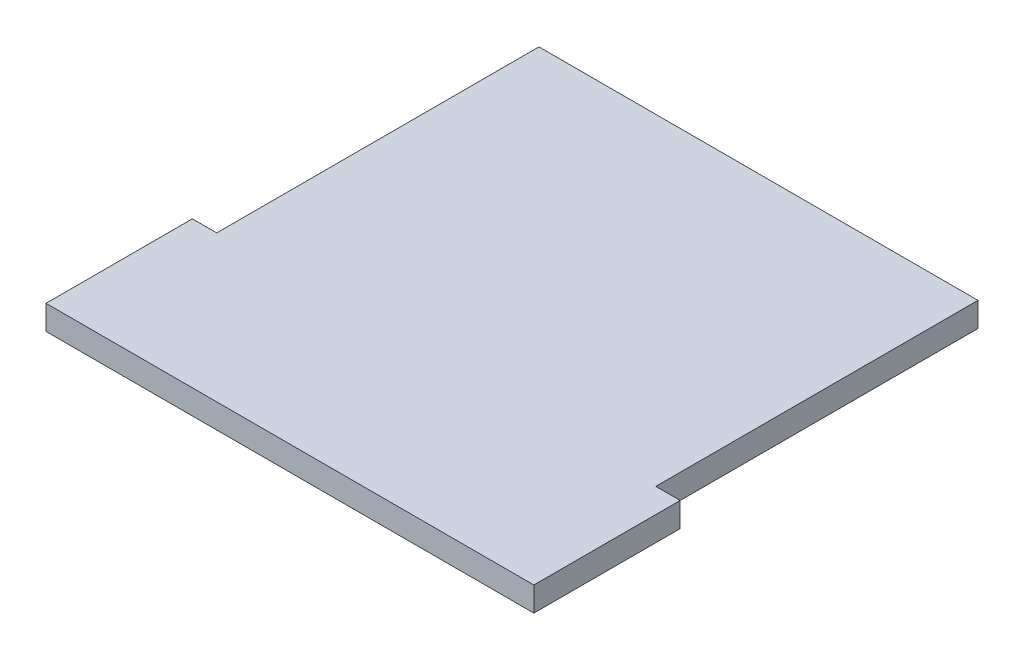
ISO-10303-21;
HEADER;
FILE_DESCRIPTION(('STEP AP214'),'2;1');
FILE_NAME('part.step','',(''),(''),'','','');
FILE_SCHEMA(('AUTOMOTIVE_DESIGN { 1 0 10303 214 1 1 1 1 }'));
ENDSEC;
DATA;
#1=APPLICATION_CONTEXT('core data for automotive mechanical design processes');
#2=APPLICATION_PROTOCOL_DEFINITION('international standard','automotive_design',2000,#1);
#3=PRODUCT_CONTEXT('',#1,'mechanical');
#4=PRODUCT('Part','Part','',(#3));
#5=PRODUCT_RELATED_PRODUCT_CATEGORY('part','',(#4));
#6=PRODUCT_DEFINITION_FORMATION('','',#4);
#7=PRODUCT_DEFINITION_CONTEXT('part definition',#1,'design');
#8=PRODUCT_DEFINITION('design','',#6,#7);
#9=PRODUCT_DEFINITION_SHAPE('','',#8);
#10=(LENGTH_UNIT() NAMED_UNIT(*) SI_UNIT(.MILLI.,.METRE.));
#11=(NAMED_UNIT(*) PLANE_ANGLE_UNIT() SI_UNIT($,.RADIAN.));
#12=(NAMED_UNIT(*) SI_UNIT($,.STERADIAN.) SOLID_ANGLE_UNIT());
#13=UNCERTAINTY_MEASURE_WITH_UNIT(LENGTH_MEASURE(1.E-05),#10,'distance_accuracy_value','');
#14=(GEOMETRIC_REPRESENTATION_CONTEXT(3) GLOBAL_UNCERTAINTY_ASSIGNED_CONTEXT((#13)) GLOBAL_UNIT_ASSIGNED_CONTEXT((#10,
#11,#12)) REPRESENTATION_CONTEXT('',''));
#15=CARTESIAN_POINT('',(0.,0.,0.));
#16=DIRECTION('',(0.,0.,1.));
#17=DIRECTION('',(1.,0.,0.));
#18=AXIS2_PLACEMENT_3D('',#15,#16,#17);
#19=CARTESIAN_POINT('',(-15.875,1.5875,-9.52499999999999));
#20=DIRECTION('',(0.,0.,1.));
#21=DIRECTION('',(1.,0.,0.));
#22=AXIS2_PLACEMENT_3D('',#19,#20,#21);
#23=PLANE('',#22);
#24=DIRECTION('',(-1.,0.,0.));
#25=VECTOR('',#24,1.);
#26=CARTESIAN_POINT('',(-15.875,0.,-9.52499999999999));
#27=LINE('',#26,#25);
#28=CARTESIAN_POINT('',(-14.2875,0.,-9.52499999999999));
#29=VERTEX_POINT('',#28);
#30=CARTESIAN_POINT('',(-15.875,0.,-9.52499999999999));
#31=VERTEX_POINT('',#30);
#32=EDGE_CURVE('E129',#29,#31,#27,.T.);
#33=ORIENTED_EDGE('',*,*,#32,.T.);
#34=DIRECTION('',(0.,-1.,0.));
#35=VECTOR('',#34,1.);
#36=CARTESIAN_POINT('',(-15.875,1.5875,-9.52499999999999));
#37=LINE('',#36,#35);
#38=CARTESIAN_POINT('',(-15.875,1.5875,-9.52499999999999));
#39=VERTEX_POINT('',#38);
#40=EDGE_CURVE('E11',#39,#31,#37,.T.);
#41=ORIENTED_EDGE('',*,*,#40,.F.);
#42=DIRECTION('',(-1.,0.,0.));
#43=VECTOR('',#42,1.);
#44=CARTESIAN_POINT('',(-15.875,1.5875,-9.52499999999999));
#45=LINE('',#44,#43);
#46=CARTESIAN_POINT('',(-14.2875,1.5875,-9.52499999999999));
#47=VERTEX_POINT('',#46);
#48=EDGE_CURVE('E143',#47,#39,#45,.T.);
#49=ORIENTED_EDGE('',*,*,#48,.F.);
#50=DIRECTION('',(0.,-1.,0.));
#51=VECTOR('',#50,1.);
#52=CARTESIAN_POINT('',(-14.2875,1.5875,-9.52499999999999));
#53=LINE('',#52,#51);
#54=EDGE_CURVE('E125',#47,#29,#53,.T.);
#55=ORIENTED_EDGE('',*,*,#54,.T.);
#56=EDGE_LOOP('',(#33,#41,#49,#55));
#57=FACE_BOUND('',#56,.T.);
#58=ADVANCED_FACE('F33',(#57),#23,.F.);
#59=CARTESIAN_POINT('',(-15.875,1.5875,0.));
#60=DIRECTION('',(1.,0.,0.));
#61=DIRECTION('',(0.,0.,-1.));
#62=AXIS2_PLACEMENT_3D('',#59,#60,#61);
#63=PLANE('',#62);
#64=DIRECTION('',(0.,0.,1.));
#65=VECTOR('',#64,1.);
#66=CARTESIAN_POINT('',(-15.875,0.,0.));
#67=LINE('',#66,#65);
#68=CARTESIAN_POINT('',(-15.875,0.,0.));
#69=VERTEX_POINT('',#68);
#70=EDGE_CURVE('E132',#31,#69,#67,.T.);
#71=ORIENTED_EDGE('',*,*,#70,.T.);
#72=DIRECTION('',(0.,-1.,0.));
#73=VECTOR('',#72,1.);
#74=CARTESIAN_POINT('',(-15.875,1.5875,0.));
#75=LINE('',#74,#73);
#76=CARTESIAN_POINT('',(-15.875,1.5875,0.));
#77=VERTEX_POINT('',#76);
#78=EDGE_CURVE('E41',#77,#69,#75,.T.);
#79=ORIENTED_EDGE('',*,*,#78,.F.);
#80=DIRECTION('',(0.,0.,1.));
#81=VECTOR('',#80,1.);
#82=CARTESIAN_POINT('',(-15.875,1.5875,0.));
#83=LINE('',#82,#81);
#84=EDGE_CURVE('E92',#39,#77,#83,.T.);
#85=ORIENTED_EDGE('',*,*,#84,.F.);
#86=ORIENTED_EDGE('',*,*,#40,.T.);
#87=EDGE_LOOP('',(#71,#79,#85,#86));
#88=FACE_BOUND('',#87,.T.);
#89=ADVANCED_FACE('F178',(#88),#63,.F.);
#90=CARTESIAN_POINT('',(15.875,1.5875,0.));
#91=DIRECTION('',(0.,0.,-1.));
#92=DIRECTION('',(-1.,0.,0.));
#93=AXIS2_PLACEMENT_3D('',#90,#91,#92);
#94=PLANE('',#93);
#95=DIRECTION('',(1.,0.,0.));
#96=VECTOR('',#95,1.);
#97=CARTESIAN_POINT('',(15.875,0.,0.));
#98=LINE('',#97,#96);
#99=CARTESIAN_POINT('',(15.875,0.,0.));
#100=VERTEX_POINT('',#99);
#101=EDGE_CURVE('E134',#69,#100,#98,.T.);
#102=ORIENTED_EDGE('',*,*,#101,.T.);
#103=DIRECTION('',(0.,-1.,0.));
#104=VECTOR('',#103,1.);
#105=CARTESIAN_POINT('',(15.875,1.5875,0.));
#106=LINE('',#105,#104);
#107=CARTESIAN_POINT('',(15.875,1.5875,0.));
#108=VERTEX_POINT('',#107);
#109=EDGE_CURVE('E150',#108,#100,#106,.T.);
#110=ORIENTED_EDGE('',*,*,#109,.F.);
#111=DIRECTION('',(1.,0.,0.));
#112=VECTOR('',#111,1.);
#113=CARTESIAN_POINT('',(15.875,1.5875,0.));
#114=LINE('',#113,#112);
#115=EDGE_CURVE('E158',#77,#108,#114,.T.);
#116=ORIENTED_EDGE('',*,*,#115,.F.);
#117=ORIENTED_EDGE('',*,*,#78,.T.);
#118=EDGE_LOOP('',(#102,#110,#116,#117));
#119=FACE_BOUND('',#118,.T.);
#120=ADVANCED_FACE('F156',(#119),#94,.F.);
#121=CARTESIAN_POINT('',(15.875,1.5875,-9.525));
#122=DIRECTION('',(-1.,0.,0.));
#123=DIRECTION('',(0.,0.,1.));
#124=AXIS2_PLACEMENT_3D('',#121,#122,#123);
#125=PLANE('',#124);
#126=DIRECTION('',(0.,0.,-1.));
#127=VECTOR('',#126,1.);
#128=CARTESIAN_POINT('',(15.875,0.,-9.525));
#129=LINE('',#128,#127);
#130=CARTESIAN_POINT('',(15.875,0.,-9.525));
#131=VERTEX_POINT('',#130);
#132=EDGE_CURVE('E136',#100,#131,#129,.T.);
#133=ORIENTED_EDGE('',*,*,#132,.T.);
#134=DIRECTION('',(0.,-1.,0.));
#135=VECTOR('',#134,1.);
#136=CARTESIAN_POINT('',(15.875,1.5875,-9.525));
#137=LINE('',#136,#135);
#138=CARTESIAN_POINT('',(15.875,1.5875,-9.525));
#139=VERTEX_POINT('',#138);
#140=EDGE_CURVE('E147',#139,#131,#137,.T.);
#141=ORIENTED_EDGE('',*,*,#140,.F.);
#142=DIRECTION('',(0.,0.,-1.));
#143=VECTOR('',#142,1.);
#144=CARTESIAN_POINT('',(15.875,1.5875,-9.525));
#145=LINE('',#144,#143);
#146=EDGE_CURVE('E170',#108,#139,#145,.T.);
#147=ORIENTED_EDGE('',*,*,#146,.F.);
#148=ORIENTED_EDGE('',*,*,#109,.T.);
#149=EDGE_LOOP('',(#133,#141,#147,#148));
#150=FACE_BOUND('',#149,.T.);
#151=ADVANCED_FACE('F166',(#150),#125,.F.);
#152=CARTESIAN_POINT('',(14.2875,1.5875,-9.525));
#153=DIRECTION('',(0.,0.,1.));
#154=DIRECTION('',(1.,0.,0.));
#155=AXIS2_PLACEMENT_3D('',#152,#153,#154);
#156=PLANE('',#155);
#157=DIRECTION('',(-1.,0.,0.));
#158=VECTOR('',#157,1.);
#159=CARTESIAN_POINT('',(14.2875,0.,-9.525));
#160=LINE('',#159,#158);
#161=CARTESIAN_POINT('',(14.2875,0.,-9.525));
#162=VERTEX_POINT('',#161);
#163=EDGE_CURVE('E138',#131,#162,#160,.T.);
#164=ORIENTED_EDGE('',*,*,#163,.T.);
#165=DIRECTION('',(0.,-1.,0.));
#166=VECTOR('',#165,1.);
#167=CARTESIAN_POINT('',(14.2875,1.5875,-9.525));
#168=LINE('',#167,#166);
#169=CARTESIAN_POINT('',(14.2875,1.5875,-9.525));
#170=VERTEX_POINT('',#169);
#171=EDGE_CURVE('E120',#170,#162,#168,.T.);
#172=ORIENTED_EDGE('',*,*,#171,.F.);
#173=DIRECTION('',(-1.,0.,0.));
#174=VECTOR('',#173,1.);
#175=CARTESIAN_POINT('',(14.2875,1.5875,-9.525));
#176=LINE('',#175,#174);
#177=EDGE_CURVE('E111',#139,#170,#176,.T.);
#178=ORIENTED_EDGE('',*,*,#177,.F.);
#179=ORIENTED_EDGE('',*,*,#140,.T.);
#180=EDGE_LOOP('',(#164,#172,#178,#179));
#181=FACE_BOUND('',#180,.T.);
#182=ADVANCED_FACE('F169',(#181),#156,.F.);
#183=CARTESIAN_POINT('',(14.2875,1.5875,-30.4939155743076));
#184=DIRECTION('',(-1.,0.,0.));
#185=DIRECTION('',(0.,0.,1.));
#186=AXIS2_PLACEMENT_3D('',#183,#184,#185);
#187=PLANE('',#186);
#188=DIRECTION('',(0.,0.,-1.));
#189=VECTOR('',#188,1.);
#190=CARTESIAN_POINT('',(14.2875,0.,-30.4939155743076));
#191=LINE('',#190,#189);
#192=CARTESIAN_POINT('',(14.2875,0.,-30.4939155743076));
#193=VERTEX_POINT('',#192);
#194=EDGE_CURVE('E119',#162,#193,#191,.T.);
#195=ORIENTED_EDGE('',*,*,#194,.T.);
#196=DIRECTION('',(0.,-1.,0.));
#197=VECTOR('',#196,1.);
#198=CARTESIAN_POINT('',(14.2875,1.5875,-30.4939155743076));
#199=LINE('',#198,#197);
#200=CARTESIAN_POINT('',(14.2875,1.5875,-30.4939155743076));
#201=VERTEX_POINT('',#200);
#202=EDGE_CURVE('E116',#201,#193,#199,.T.);
#203=ORIENTED_EDGE('',*,*,#202,.F.);
#204=DIRECTION('',(0.,0.,-1.));
#205=VECTOR('',#204,1.);
#206=CARTESIAN_POINT('',(14.2875,1.5875,-30.4939155743076));
#207=LINE('',#206,#205);
#208=EDGE_CURVE('E105',#170,#201,#207,.T.);
#209=ORIENTED_EDGE('',*,*,#208,.F.);
#210=ORIENTED_EDGE('',*,*,#171,.T.);
#211=EDGE_LOOP('',(#195,#203,#209,#210));
#212=FACE_BOUND('',#211,.T.);
#213=ADVANCED_FACE('F117',(#212),#187,.F.);
#214=CARTESIAN_POINT('',(-14.2875,1.5875,-30.4939155743076));
#215=DIRECTION('',(0.,0.,1.));
#216=DIRECTION('',(1.,0.,0.));
#217=AXIS2_PLACEMENT_3D('',#214,#215,#216);
#218=PLANE('',#217);
#219=DIRECTION('',(-1.,0.,0.));
#220=VECTOR('',#219,1.);
#221=CARTESIAN_POINT('',(-14.2875,0.,-30.4939155743076));
#222=LINE('',#221,#220);
#223=CARTESIAN_POINT('',(-14.2875,0.,-30.4939155743076));
#224=VERTEX_POINT('',#223);
#225=EDGE_CURVE('E78',#193,#224,#222,.T.);
#226=ORIENTED_EDGE('',*,*,#225,.T.);
#227=DIRECTION('',(0.,-1.,0.));
#228=VECTOR('',#227,1.);
#229=CARTESIAN_POINT('',(-14.2875,1.5875,-30.4939155743076));
#230=LINE('',#229,#228);
#231=CARTESIAN_POINT('',(-14.2875,1.5875,-30.4939155743076));
#232=VERTEX_POINT('',#231);
#233=EDGE_CURVE('E121',#232,#224,#230,.T.);
#234=ORIENTED_EDGE('',*,*,#233,.F.);
#235=DIRECTION('',(-1.,0.,0.));
#236=VECTOR('',#235,1.);
#237=CARTESIAN_POINT('',(-14.2875,1.5875,-30.4939155743076));
#238=LINE('',#237,#236);
#239=EDGE_CURVE('E109',#201,#232,#238,.T.);
#240=ORIENTED_EDGE('',*,*,#239,.F.);
#241=ORIENTED_EDGE('',*,*,#202,.T.);
#242=EDGE_LOOP('',(#226,#234,#240,#241));
#243=FACE_BOUND('',#242,.T.);
#244=ADVANCED_FACE('F123',(#243),#218,.F.);
#245=CARTESIAN_POINT('',(-14.2875,1.5875,-9.52499999999999));
#246=DIRECTION('',(1.,0.,0.));
#247=DIRECTION('',(0.,0.,-1.));
#248=AXIS2_PLACEMENT_3D('',#245,#246,#247);
#249=PLANE('',#248);
#250=DIRECTION('',(0.,0.,1.));
#251=VECTOR('',#250,1.);
#252=CARTESIAN_POINT('',(-14.2875,0.,-9.52499999999999));
#253=LINE('',#252,#251);
#254=EDGE_CURVE('E84',#224,#29,#253,.T.);
#255=ORIENTED_EDGE('',*,*,#254,.T.);
#256=ORIENTED_EDGE('',*,*,#54,.F.);
#257=DIRECTION('',(0.,0.,1.));
#258=VECTOR('',#257,1.);
#259=CARTESIAN_POINT('',(-14.2875,1.5875,-9.52499999999999));
#260=LINE('',#259,#258);
#261=EDGE_CURVE('E49',#232,#47,#260,.T.);
#262=ORIENTED_EDGE('',*,*,#261,.F.);
#263=ORIENTED_EDGE('',*,*,#233,.T.);
#264=EDGE_LOOP('',(#255,#256,#262,#263));
#265=FACE_BOUND('',#264,.T.);
#266=ADVANCED_FACE('F194',(#265),#249,.F.);
#267=CARTESIAN_POINT('',(0.,1.5875,0.));
#268=DIRECTION('',(0.,1.,0.));
#269=DIRECTION('',(0.,0.,1.));
#270=AXIS2_PLACEMENT_3D('',#267,#268,#269);
#271=PLANE('',#270);
#272=ORIENTED_EDGE('',*,*,#48,.T.);
#273=ORIENTED_EDGE('',*,*,#84,.T.);
#274=ORIENTED_EDGE('',*,*,#115,.T.);
#275=ORIENTED_EDGE('',*,*,#146,.T.);
#276=ORIENTED_EDGE('',*,*,#177,.T.);
#277=ORIENTED_EDGE('',*,*,#208,.T.);
#278=ORIENTED_EDGE('',*,*,#239,.T.);
#279=ORIENTED_EDGE('',*,*,#261,.T.);
#280=EDGE_LOOP('',(#272,#273,#274,#275,#276,#277,#278,#279));
#281=FACE_BOUND('',#280,.T.);
#282=ADVANCED_FACE('F107',(#281),#271,.T.);
#283=CARTESIAN_POINT('',(0.,0.,0.));
#284=DIRECTION('',(0.,1.,0.));
#285=DIRECTION('',(0.,0.,1.));
#286=AXIS2_PLACEMENT_3D('',#283,#284,#285);
#287=PLANE('',#286);
#288=ORIENTED_EDGE('',*,*,#32,.F.);
#289=ORIENTED_EDGE('',*,*,#254,.F.);
#290=ORIENTED_EDGE('',*,*,#225,.F.);
#291=ORIENTED_EDGE('',*,*,#194,.F.);
#292=ORIENTED_EDGE('',*,*,#163,.F.);
#293=ORIENTED_EDGE('',*,*,#132,.F.);
#294=ORIENTED_EDGE('',*,*,#101,.F.);
#295=ORIENTED_EDGE('',*,*,#70,.F.);
#296=EDGE_LOOP('',(#288,#289,#290,#291,#292,#293,#294,#295));
#297=FACE_BOUND('',#296,.T.);
#298=ADVANCED_FACE('F162',(#297),#287,.F.);
#299=CLOSED_SHELL('',(#58,#89,#120,#151,#182,#213,#244,#266,#282,#298));
#300=MANIFOLD_SOLID_BREP('B2',#299);
#301=ADVANCED_BREP_SHAPE_REPRESENTATION('',(#18,#300),#14);
#302=SHAPE_DEFINITION_REPRESENTATION(#9,#301);
ENDSEC;
END-ISO-10303-21;
